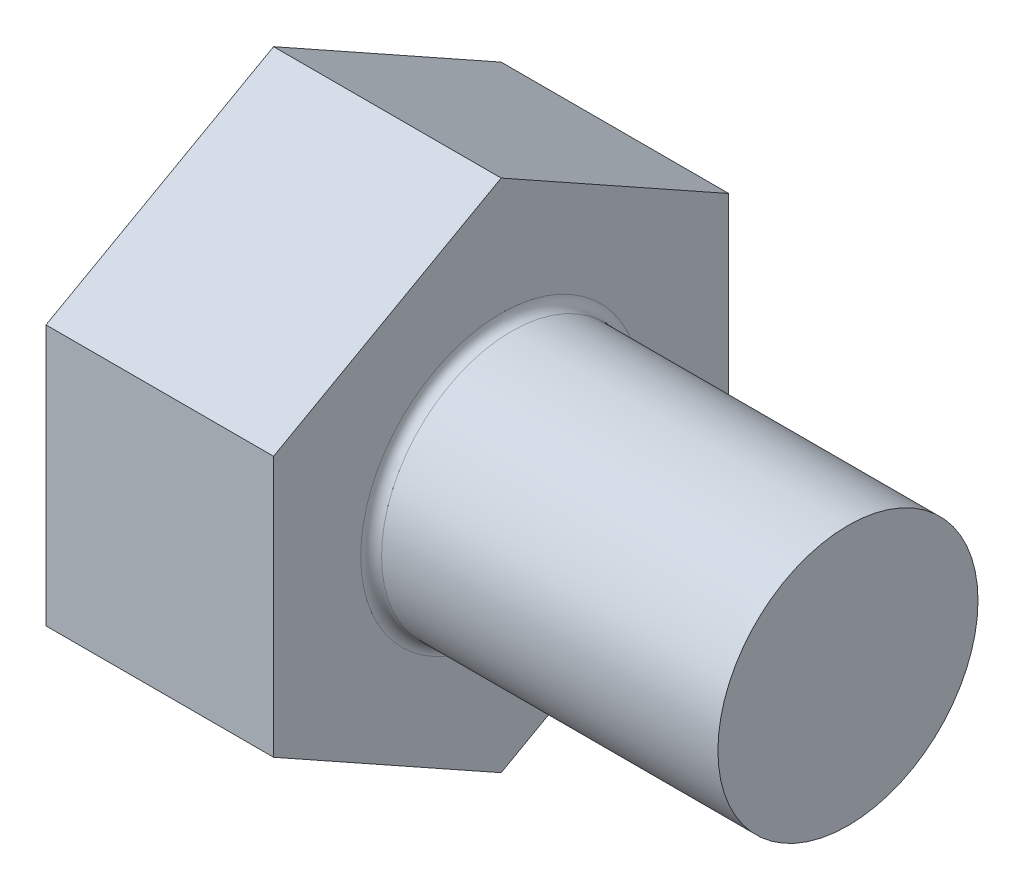
ISO-10303-21;
HEADER;
FILE_DESCRIPTION(('STEP AP214'),'2;1');
FILE_NAME('part.step','',(''),(''),'','','');
FILE_SCHEMA(('AUTOMOTIVE_DESIGN { 1 0 10303 214 1 1 1 1 }'));
ENDSEC;
DATA;
#1=APPLICATION_CONTEXT('core data for automotive mechanical design processes');
#2=APPLICATION_PROTOCOL_DEFINITION('international standard','automotive_design',2000,#1);
#3=PRODUCT_CONTEXT('',#1,'mechanical');
#4=PRODUCT('Part','Part','',(#3));
#5=PRODUCT_RELATED_PRODUCT_CATEGORY('part','',(#4));
#6=PRODUCT_DEFINITION_FORMATION('','',#4);
#7=PRODUCT_DEFINITION_CONTEXT('part definition',#1,'design');
#8=PRODUCT_DEFINITION('design','',#6,#7);
#9=PRODUCT_DEFINITION_SHAPE('','',#8);
#10=(LENGTH_UNIT() NAMED_UNIT(*) SI_UNIT(.MILLI.,.METRE.));
#11=(NAMED_UNIT(*) PLANE_ANGLE_UNIT() SI_UNIT($,.RADIAN.));
#12=(NAMED_UNIT(*) SI_UNIT($,.STERADIAN.) SOLID_ANGLE_UNIT());
#13=UNCERTAINTY_MEASURE_WITH_UNIT(LENGTH_MEASURE(1.E-05),#10,'distance_accuracy_value','');
#14=(GEOMETRIC_REPRESENTATION_CONTEXT(3) GLOBAL_UNCERTAINTY_ASSIGNED_CONTEXT((#13)) GLOBAL_UNIT_ASSIGNED_CONTEXT((#10,
#11,#12)) REPRESENTATION_CONTEXT('',''));
#15=CARTESIAN_POINT('',(0.,0.,0.));
#16=DIRECTION('',(0.,0.,1.));
#17=DIRECTION('',(1.,0.,0.));
#18=AXIS2_PLACEMENT_3D('',#15,#16,#17);
#19=CARTESIAN_POINT('',(-10.5833333333333,0.,0.));
#20=DIRECTION('',(-1.,0.,0.));
#21=DIRECTION('',(0.,0.,1.));
#22=AXIS2_PLACEMENT_3D('',#19,#20,#21);
#23=CYLINDRICAL_SURFACE('',#22,3.175);
#24=CARTESIAN_POINT('',(0.254000000000001,0.,0.));
#25=DIRECTION('',(-1.,0.,0.));
#26=DIRECTION('',(0.,0.,1.));
#27=AXIS2_PLACEMENT_3D('',#24,#25,#26);
#28=CIRCLE('',#27,3.175);
#29=CARTESIAN_POINT('',(0.254000000000001,0.,3.175));
#30=VERTEX_POINT('',#29);
#31=EDGE_CURVE('E11',#30,#30,#28,.F.);
#32=ORIENTED_EDGE('',*,*,#31,.T.);
#33=EDGE_LOOP('',(#32));
#34=FACE_BOUND('',#33,.T.);
#35=CARTESIAN_POINT('',(8.46666666666666,0.,0.));
#36=DIRECTION('',(-1.,0.,0.));
#37=DIRECTION('',(0.,0.,1.));
#38=AXIS2_PLACEMENT_3D('',#35,#36,#37);
#39=CIRCLE('',#38,3.175);
#40=CARTESIAN_POINT('',(8.46666666666666,0.,3.175));
#41=VERTEX_POINT('',#40);
#42=EDGE_CURVE('E140',#41,#41,#39,.T.);
#43=ORIENTED_EDGE('',*,*,#42,.T.);
#44=EDGE_LOOP('',(#43));
#45=FACE_BOUND('',#44,.T.);
#46=ADVANCED_FACE('F35',(#34,#45),#23,.T.);
#47=CARTESIAN_POINT('',(8.46666666666667,0.,0.));
#48=DIRECTION('',(-1.,0.,0.));
#49=DIRECTION('',(0.,0.,1.));
#50=AXIS2_PLACEMENT_3D('',#47,#48,#49);
#51=PLANE('',#50);
#52=ORIENTED_EDGE('',*,*,#42,.F.);
#53=EDGE_LOOP('',(#52));
#54=FACE_BOUND('',#53,.T.);
#55=ADVANCED_FACE('F156',(#54),#51,.F.);
#56=CARTESIAN_POINT('',(-5.55625,3.18229490136111,-5.55625));
#57=DIRECTION('',(0.,-0.872994202646574,0.487730583565838));
#58=DIRECTION('',(0.,-0.487730583565838,-0.872994202646574));
#59=AXIS2_PLACEMENT_3D('',#56,#57,#58);
#60=PLANE('',#59);
#61=DIRECTION('',(0.,-0.487730583565838,-0.872994202646574));
#62=VECTOR('',#61,1.);
#63=CARTESIAN_POINT('',(0.,3.18229490136111,-5.55625));
#64=LINE('',#63,#62);
#65=CARTESIAN_POINT('',(0.,6.2865,0.));
#66=VERTEX_POINT('',#65);
#67=CARTESIAN_POINT('',(0.,3.18229490136111,-5.55625));
#68=VERTEX_POINT('',#67);
#69=EDGE_CURVE('E121',#66,#68,#64,.T.);
#70=ORIENTED_EDGE('',*,*,#69,.T.);
#71=DIRECTION('',(1.,0.,0.));
#72=VECTOR('',#71,1.);
#73=CARTESIAN_POINT('',(-5.55625,3.18229490136111,-5.55625));
#74=LINE('',#73,#72);
#75=CARTESIAN_POINT('',(-5.55625,3.18229490136111,-5.55625));
#76=VERTEX_POINT('',#75);
#77=EDGE_CURVE('E138',#76,#68,#74,.T.);
#78=ORIENTED_EDGE('',*,*,#77,.F.);
#79=DIRECTION('',(0.,-0.487730583565838,-0.872994202646574));
#80=VECTOR('',#79,1.);
#81=CARTESIAN_POINT('',(-5.55625,3.18229490136111,-5.55625));
#82=LINE('',#81,#80);
#83=CARTESIAN_POINT('',(-5.55625,6.2865,0.));
#84=VERTEX_POINT('',#83);
#85=EDGE_CURVE('E131',#84,#76,#82,.T.);
#86=ORIENTED_EDGE('',*,*,#85,.F.);
#87=DIRECTION('',(1.,0.,0.));
#88=VECTOR('',#87,1.);
#89=CARTESIAN_POINT('',(-5.55625,6.2865,0.));
#90=LINE('',#89,#88);
#91=EDGE_CURVE('E117',#84,#66,#90,.T.);
#92=ORIENTED_EDGE('',*,*,#91,.T.);
#93=EDGE_LOOP('',(#70,#78,#86,#92));
#94=FACE_BOUND('',#93,.T.);
#95=ADVANCED_FACE('F161',(#94),#60,.F.);
#96=CARTESIAN_POINT('',(-5.55625,-3.18229490136111,-5.55625));
#97=DIRECTION('',(0.,0.,1.));
#98=DIRECTION('',(1.,0.,0.));
#99=AXIS2_PLACEMENT_3D('',#96,#97,#98);
#100=PLANE('',#99);
#101=DIRECTION('',(0.,-1.,0.));
#102=VECTOR('',#101,1.);
#103=CARTESIAN_POINT('',(0.,-3.18229490136111,-5.55625));
#104=LINE('',#103,#102);
#105=CARTESIAN_POINT('',(0.,-3.18229490136111,-5.55625));
#106=VERTEX_POINT('',#105);
#107=EDGE_CURVE('E124',#68,#106,#104,.T.);
#108=ORIENTED_EDGE('',*,*,#107,.T.);
#109=DIRECTION('',(1.,0.,0.));
#110=VECTOR('',#109,1.);
#111=CARTESIAN_POINT('',(-5.55625,-3.18229490136111,-5.55625));
#112=LINE('',#111,#110);
#113=CARTESIAN_POINT('',(-5.55625,-3.18229490136111,-5.55625));
#114=VERTEX_POINT('',#113);
#115=EDGE_CURVE('E135',#114,#106,#112,.T.);
#116=ORIENTED_EDGE('',*,*,#115,.F.);
#117=DIRECTION('',(0.,-1.,0.));
#118=VECTOR('',#117,1.);
#119=CARTESIAN_POINT('',(-5.55625,-3.18229490136111,-5.55625));
#120=LINE('',#119,#118);
#121=EDGE_CURVE('E90',#76,#114,#120,.T.);
#122=ORIENTED_EDGE('',*,*,#121,.F.);
#123=ORIENTED_EDGE('',*,*,#77,.T.);
#124=EDGE_LOOP('',(#108,#116,#122,#123));
#125=FACE_BOUND('',#124,.T.);
#126=ADVANCED_FACE('F168',(#125),#100,.F.);
#127=CARTESIAN_POINT('',(-5.55625,-6.2865,0.));
#128=DIRECTION('',(0.,0.872994202646574,0.487730583565838));
#129=DIRECTION('',(0.,-0.487730583565838,0.872994202646574));
#130=AXIS2_PLACEMENT_3D('',#127,#128,#129);
#131=PLANE('',#130);
#132=DIRECTION('',(0.,-0.487730583565838,0.872994202646574));
#133=VECTOR('',#132,1.);
#134=CARTESIAN_POINT('',(0.,-6.2865,0.));
#135=LINE('',#134,#133);
#136=CARTESIAN_POINT('',(0.,-6.2865,0.));
#137=VERTEX_POINT('',#136);
#138=EDGE_CURVE('E126',#106,#137,#135,.T.);
#139=ORIENTED_EDGE('',*,*,#138,.T.);
#140=DIRECTION('',(1.,0.,0.));
#141=VECTOR('',#140,1.);
#142=CARTESIAN_POINT('',(-5.55625,-6.2865,0.));
#143=LINE('',#142,#141);
#144=CARTESIAN_POINT('',(-5.55625,-6.2865,0.));
#145=VERTEX_POINT('',#144);
#146=EDGE_CURVE('E112',#145,#137,#143,.T.);
#147=ORIENTED_EDGE('',*,*,#146,.F.);
#148=DIRECTION('',(0.,-0.487730583565838,0.872994202646574));
#149=VECTOR('',#148,1.);
#150=CARTESIAN_POINT('',(-5.55625,-6.2865,0.));
#151=LINE('',#150,#149);
#152=EDGE_CURVE('E103',#114,#145,#151,.T.);
#153=ORIENTED_EDGE('',*,*,#152,.F.);
#154=ORIENTED_EDGE('',*,*,#115,.T.);
#155=EDGE_LOOP('',(#139,#147,#153,#154));
#156=FACE_BOUND('',#155,.T.);
#157=ADVANCED_FACE('F172',(#156),#131,.F.);
#158=CARTESIAN_POINT('',(-5.55625,-3.18229490136111,5.55625));
#159=DIRECTION('',(0.,0.872994202646574,-0.487730583565838));
#160=DIRECTION('',(0.,0.487730583565838,0.872994202646574));
#161=AXIS2_PLACEMENT_3D('',#158,#159,#160);
#162=PLANE('',#161);
#163=DIRECTION('',(0.,0.487730583565838,0.872994202646574));
#164=VECTOR('',#163,1.);
#165=CARTESIAN_POINT('',(0.,-3.18229490136111,5.55625));
#166=LINE('',#165,#164);
#167=CARTESIAN_POINT('',(0.,-3.18229490136111,5.55625));
#168=VERTEX_POINT('',#167);
#169=EDGE_CURVE('E111',#137,#168,#166,.T.);
#170=ORIENTED_EDGE('',*,*,#169,.T.);
#171=DIRECTION('',(1.,0.,0.));
#172=VECTOR('',#171,1.);
#173=CARTESIAN_POINT('',(-5.55625,-3.18229490136111,5.55625));
#174=LINE('',#173,#172);
#175=CARTESIAN_POINT('',(-5.55625,-3.18229490136111,5.55625));
#176=VERTEX_POINT('',#175);
#177=EDGE_CURVE('E108',#176,#168,#174,.T.);
#178=ORIENTED_EDGE('',*,*,#177,.F.);
#179=DIRECTION('',(0.,0.487730583565838,0.872994202646574));
#180=VECTOR('',#179,1.);
#181=CARTESIAN_POINT('',(-5.55625,-3.18229490136111,5.55625));
#182=LINE('',#181,#180);
#183=EDGE_CURVE('E97',#145,#176,#182,.T.);
#184=ORIENTED_EDGE('',*,*,#183,.F.);
#185=ORIENTED_EDGE('',*,*,#146,.T.);
#186=EDGE_LOOP('',(#170,#178,#184,#185));
#187=FACE_BOUND('',#186,.T.);
#188=ADVANCED_FACE('F109',(#187),#162,.F.);
#189=CARTESIAN_POINT('',(-5.55625,-3.18229490136111,5.55625));
#190=DIRECTION('',(0.,0.,-1.));
#191=DIRECTION('',(-1.,0.,0.));
#192=AXIS2_PLACEMENT_3D('',#189,#190,#191);
#193=PLANE('',#192);
#194=DIRECTION('',(0.,1.,0.));
#195=VECTOR('',#194,1.);
#196=CARTESIAN_POINT('',(0.,-3.18229490136111,5.55625));
#197=LINE('',#196,#195);
#198=CARTESIAN_POINT('',(0.,3.18229490136111,5.55625));
#199=VERTEX_POINT('',#198);
#200=EDGE_CURVE('E75',#168,#199,#197,.T.);
#201=ORIENTED_EDGE('',*,*,#200,.T.);
#202=DIRECTION('',(1.,0.,0.));
#203=VECTOR('',#202,1.);
#204=CARTESIAN_POINT('',(-5.55625,3.18229490136111,5.55625));
#205=LINE('',#204,#203);
#206=CARTESIAN_POINT('',(-5.55625,3.18229490136111,5.55625));
#207=VERTEX_POINT('',#206);
#208=EDGE_CURVE('E113',#207,#199,#205,.T.);
#209=ORIENTED_EDGE('',*,*,#208,.F.);
#210=DIRECTION('',(0.,1.,0.));
#211=VECTOR('',#210,1.);
#212=CARTESIAN_POINT('',(-5.55625,-3.18229490136111,5.55625));
#213=LINE('',#212,#211);
#214=EDGE_CURVE('E101',#176,#207,#213,.T.);
#215=ORIENTED_EDGE('',*,*,#214,.F.);
#216=ORIENTED_EDGE('',*,*,#177,.T.);
#217=EDGE_LOOP('',(#201,#209,#215,#216));
#218=FACE_BOUND('',#217,.T.);
#219=ADVANCED_FACE('F115',(#218),#193,.F.);
#220=CARTESIAN_POINT('',(-5.55625,6.2865,0.));
#221=DIRECTION('',(0.,-0.872994202646574,-0.487730583565838));
#222=DIRECTION('',(0.,0.487730583565838,-0.872994202646574));
#223=AXIS2_PLACEMENT_3D('',#220,#221,#222);
#224=PLANE('',#223);
#225=DIRECTION('',(0.,0.487730583565838,-0.872994202646574));
#226=VECTOR('',#225,1.);
#227=CARTESIAN_POINT('',(0.,6.2865,0.));
#228=LINE('',#227,#226);
#229=EDGE_CURVE('E81',#199,#66,#228,.T.);
#230=ORIENTED_EDGE('',*,*,#229,.T.);
#231=ORIENTED_EDGE('',*,*,#91,.F.);
#232=DIRECTION('',(0.,0.487730583565838,-0.872994202646574));
#233=VECTOR('',#232,1.);
#234=CARTESIAN_POINT('',(-5.55625,6.2865,0.));
#235=LINE('',#234,#233);
#236=EDGE_CURVE('E52',#207,#84,#235,.T.);
#237=ORIENTED_EDGE('',*,*,#236,.F.);
#238=ORIENTED_EDGE('',*,*,#208,.T.);
#239=EDGE_LOOP('',(#230,#231,#237,#238));
#240=FACE_BOUND('',#239,.T.);
#241=ADVANCED_FACE('F180',(#240),#224,.F.);
#242=CARTESIAN_POINT('',(-5.55625,0.,0.));
#243=DIRECTION('',(-1.,0.,0.));
#244=DIRECTION('',(0.,0.,1.));
#245=AXIS2_PLACEMENT_3D('',#242,#243,#244);
#246=PLANE('',#245);
#247=ORIENTED_EDGE('',*,*,#85,.T.);
#248=ORIENTED_EDGE('',*,*,#121,.T.);
#249=ORIENTED_EDGE('',*,*,#152,.T.);
#250=ORIENTED_EDGE('',*,*,#183,.T.);
#251=ORIENTED_EDGE('',*,*,#214,.T.);
#252=ORIENTED_EDGE('',*,*,#236,.T.);
#253=EDGE_LOOP('',(#247,#248,#249,#250,#251,#252));
#254=FACE_BOUND('',#253,.T.);
#255=ADVANCED_FACE('F99',(#254),#246,.T.);
#256=CARTESIAN_POINT('',(0.,0.,0.));
#257=DIRECTION('',(-1.,0.,0.));
#258=DIRECTION('',(0.,0.,1.));
#259=AXIS2_PLACEMENT_3D('',#256,#257,#258);
#260=PLANE('',#259);
#261=CARTESIAN_POINT('',(0.,0.,0.));
#262=DIRECTION('',(-1.,0.,0.));
#263=DIRECTION('',(0.,0.,1.));
#264=AXIS2_PLACEMENT_3D('',#261,#262,#263);
#265=CIRCLE('',#264,3.429);
#266=CARTESIAN_POINT('',(0.,0.,3.429));
#267=VERTEX_POINT('',#266);
#268=EDGE_CURVE('E44',#267,#267,#265,.T.);
#269=ORIENTED_EDGE('',*,*,#268,.T.);
#270=EDGE_LOOP('',(#269));
#271=FACE_BOUND('',#270,.T.);
#272=ORIENTED_EDGE('',*,*,#69,.F.);
#273=ORIENTED_EDGE('',*,*,#229,.F.);
#274=ORIENTED_EDGE('',*,*,#200,.F.);
#275=ORIENTED_EDGE('',*,*,#169,.F.);
#276=ORIENTED_EDGE('',*,*,#138,.F.);
#277=ORIENTED_EDGE('',*,*,#107,.F.);
#278=EDGE_LOOP('',(#272,#273,#274,#275,#276,#277));
#279=FACE_BOUND('',#278,.T.);
#280=ADVANCED_FACE('F145',(#271,#279),#260,.F.);
#281=CARTESIAN_POINT('',(0.254000000000001,0.,0.));
#282=DIRECTION('',(-1.,0.,0.));
#283=DIRECTION('',(0.,0.,1.));
#284=AXIS2_PLACEMENT_3D('',#281,#282,#283);
#285=TOROIDAL_SURFACE('',#284,3.429,0.254);
#286=ORIENTED_EDGE('',*,*,#31,.F.);
#287=EDGE_LOOP('',(#286));
#288=FACE_BOUND('',#287,.T.);
#289=ORIENTED_EDGE('',*,*,#268,.F.);
#290=EDGE_LOOP('',(#289));
#291=FACE_BOUND('',#290,.T.);
#292=ADVANCED_FACE('F37',(#288,#291),#285,.F.);
#293=CLOSED_SHELL('',(#46,#55,#95,#126,#157,#188,#219,#241,#255,#280,#292));
#294=MANIFOLD_SOLID_BREP('B2',#293);
#295=ADVANCED_BREP_SHAPE_REPRESENTATION('',(#18,#294),#14);
#296=SHAPE_DEFINITION_REPRESENTATION(#9,#295);
ENDSEC;
END-ISO-10303-21;
